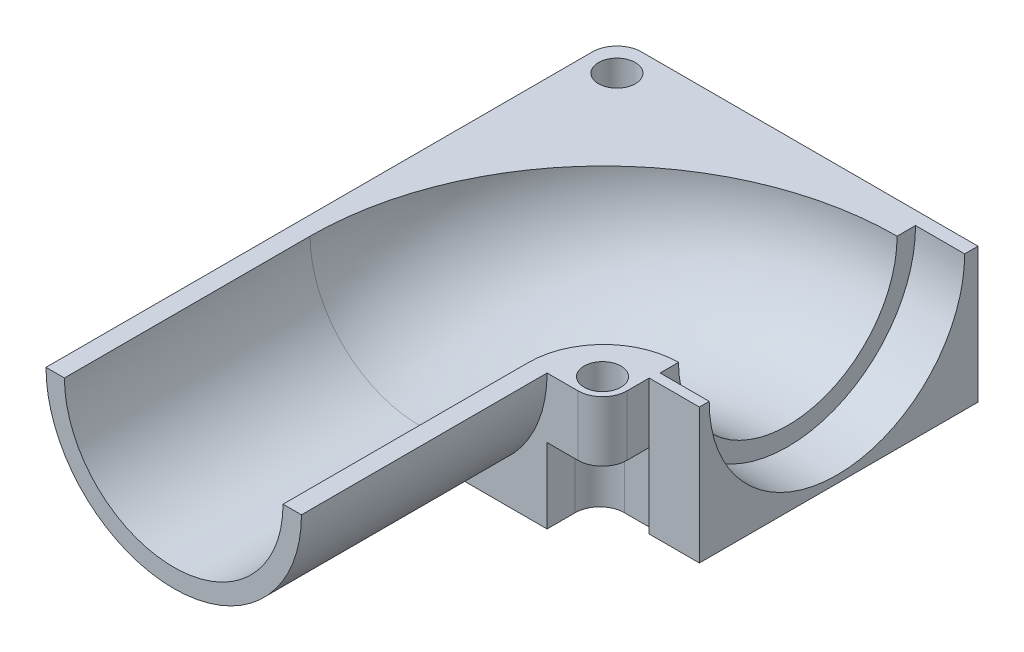
ISO-10303-21;
HEADER;
FILE_DESCRIPTION(('STEP AP214'),'2;1');
FILE_NAME('part.step','',(''),(''),'','','');
FILE_SCHEMA(('AUTOMOTIVE_DESIGN { 1 0 10303 214 1 1 1 1 }'));
ENDSEC;
DATA;
#1=APPLICATION_CONTEXT('core data for automotive mechanical design processes');
#2=APPLICATION_PROTOCOL_DEFINITION('international standard','automotive_design',2000,#1);
#3=PRODUCT_CONTEXT('',#1,'mechanical');
#4=PRODUCT('Part','Part','',(#3));
#5=PRODUCT_RELATED_PRODUCT_CATEGORY('part','',(#4));
#6=PRODUCT_DEFINITION_FORMATION('','',#4);
#7=PRODUCT_DEFINITION_CONTEXT('part definition',#1,'design');
#8=PRODUCT_DEFINITION('design','',#6,#7);
#9=PRODUCT_DEFINITION_SHAPE('','',#8);
#10=(LENGTH_UNIT() NAMED_UNIT(*) SI_UNIT(.MILLI.,.METRE.));
#11=(NAMED_UNIT(*) PLANE_ANGLE_UNIT() SI_UNIT($,.RADIAN.));
#12=(NAMED_UNIT(*) SI_UNIT($,.STERADIAN.) SOLID_ANGLE_UNIT());
#13=UNCERTAINTY_MEASURE_WITH_UNIT(LENGTH_MEASURE(1.E-05),#10,'distance_accuracy_value','');
#14=(GEOMETRIC_REPRESENTATION_CONTEXT(3) GLOBAL_UNCERTAINTY_ASSIGNED_CONTEXT((#13)) GLOBAL_UNIT_ASSIGNED_CONTEXT((#10,
#11,#12)) REPRESENTATION_CONTEXT('',''));
#15=CARTESIAN_POINT('',(0.,0.,0.));
#16=DIRECTION('',(0.,0.,1.));
#17=DIRECTION('',(1.,0.,0.));
#18=AXIS2_PLACEMENT_3D('',#15,#16,#17);
#19=CARTESIAN_POINT('',(-20.,0.,0.));
#20=DIRECTION('',(0.,1.,0.));
#21=DIRECTION('',(0.,0.,1.));
#22=AXIS2_PLACEMENT_3D('',#19,#20,#21);
#23=PLANE('',#22);
#24=DIRECTION('',(0.,0.,1.));
#25=VECTOR('',#24,1.);
#26=CARTESIAN_POINT('',(-43.4,0.,-11.4859338343792));
#27=LINE('',#26,#25);
#28=CARTESIAN_POINT('',(-43.4,0.,-11.4859338343792));
#29=VERTEX_POINT('',#28);
#30=CARTESIAN_POINT('',(-43.4,0.,-7.48593383437924));
#31=VERTEX_POINT('',#30);
#32=EDGE_CURVE('E234',#29,#31,#27,.T.);
#33=ORIENTED_EDGE('',*,*,#32,.F.);
#34=DIRECTION('',(-1.,0.,0.));
#35=VECTOR('',#34,1.);
#36=CARTESIAN_POINT('',(-20.,0.,-11.4859338343792));
#37=LINE('',#36,#35);
#38=CARTESIAN_POINT('',(-20.,0.,-11.4859338343792));
#39=VERTEX_POINT('',#38);
#40=EDGE_CURVE('E337',#39,#29,#37,.T.);
#41=ORIENTED_EDGE('',*,*,#40,.F.);
#42=DIRECTION('',(0.,0.,1.));
#43=VECTOR('',#42,1.);
#44=CARTESIAN_POINT('',(-20.,0.,-14.4859338343792));
#45=LINE('',#44,#43);
#46=CARTESIAN_POINT('',(-20.,0.,11.2));
#47=VERTEX_POINT('',#46);
#48=EDGE_CURVE('E221',#39,#47,#45,.T.);
#49=ORIENTED_EDGE('',*,*,#48,.T.);
#50=DIRECTION('',(1.,0.,0.));
#51=VECTOR('',#50,1.);
#52=CARTESIAN_POINT('',(-20.,0.,11.2));
#53=LINE('',#52,#51);
#54=CARTESIAN_POINT('',(-24.0873861292754,0.,11.2));
#55=VERTEX_POINT('',#54);
#56=EDGE_CURVE('E310',#55,#47,#53,.T.);
#57=ORIENTED_EDGE('',*,*,#56,.F.);
#58=DIRECTION('',(0.,0.,1.));
#59=VECTOR('',#58,1.);
#60=CARTESIAN_POINT('',(-24.0873861292754,0.,10.7081648037772));
#61=LINE('',#60,#59);
#62=CARTESIAN_POINT('',(-24.0873861292754,0.,10.7081648037772));
#63=VERTEX_POINT('',#62);
#64=EDGE_CURVE('E295',#63,#55,#61,.T.);
#65=ORIENTED_EDGE('',*,*,#64,.F.);
#66=DIRECTION('',(1.,0.,0.));
#67=VECTOR('',#66,1.);
#68=CARTESIAN_POINT('',(-24.0873861292754,0.,10.7081648037772));
#69=LINE('',#68,#67);
#70=CARTESIAN_POINT('',(-26.6,0.,10.7081648037772));
#71=VERTEX_POINT('',#70);
#72=EDGE_CURVE('E276',#71,#63,#69,.T.);
#73=ORIENTED_EDGE('',*,*,#72,.F.);
#74=CARTESIAN_POINT('',(-26.6,0.,12.7081648037772));
#75=DIRECTION('',(0.,-1.,0.));
#76=DIRECTION('',(0.,0.,-1.));
#77=AXIS2_PLACEMENT_3D('',#74,#75,#76);
#78=CIRCLE('',#77,2.);
#79=CARTESIAN_POINT('',(-28.6,0.,12.7081648037772));
#80=VERTEX_POINT('',#79);
#81=EDGE_CURVE('E280',#80,#71,#78,.T.);
#82=ORIENTED_EDGE('',*,*,#81,.F.);
#83=DIRECTION('',(0.,0.,-1.));
#84=VECTOR('',#83,1.);
#85=CARTESIAN_POINT('',(-28.6,0.,12.7081648037772));
#86=LINE('',#85,#84);
#87=CARTESIAN_POINT('',(-28.6,0.,15.));
#88=VERTEX_POINT('',#87);
#89=EDGE_CURVE('E298',#88,#80,#86,.T.);
#90=ORIENTED_EDGE('',*,*,#89,.F.);
#91=DIRECTION('',(-1.,0.,0.));
#92=VECTOR('',#91,1.);
#93=CARTESIAN_POINT('',(-20.,0.,15.));
#94=LINE('',#93,#92);
#95=CARTESIAN_POINT('',(-49.4,0.,15.));
#96=VERTEX_POINT('',#95);
#97=EDGE_CURVE('E11',#88,#96,#94,.T.);
#98=ORIENTED_EDGE('',*,*,#97,.T.);
#99=DIRECTION('',(0.,0.,1.));
#100=VECTOR('',#99,1.);
#101=CARTESIAN_POINT('',(-49.4,0.,-9.48593383437924));
#102=LINE('',#101,#100);
#103=CARTESIAN_POINT('',(-49.4,0.,-5.48593383437924));
#104=VERTEX_POINT('',#103);
#105=EDGE_CURVE('E332',#104,#96,#102,.T.);
#106=ORIENTED_EDGE('',*,*,#105,.F.);
#107=DIRECTION('',(-1.,0.,0.));
#108=VECTOR('',#107,1.);
#109=CARTESIAN_POINT('',(-45.4,0.,-5.48593383437924));
#110=LINE('',#109,#108);
#111=CARTESIAN_POINT('',(-45.4,0.,-5.48593383437924));
#112=VERTEX_POINT('',#111);
#113=EDGE_CURVE('E254',#112,#104,#110,.T.);
#114=ORIENTED_EDGE('',*,*,#113,.F.);
#115=CARTESIAN_POINT('',(-45.4,0.,-7.48593383437924));
#116=DIRECTION('',(0.,-1.,0.));
#117=DIRECTION('',(0.,0.,1.));
#118=AXIS2_PLACEMENT_3D('',#115,#116,#117);
#119=CIRCLE('',#118,2.);
#120=EDGE_CURVE('E239',#31,#112,#119,.T.);
#121=ORIENTED_EDGE('',*,*,#120,.F.);
#122=EDGE_LOOP('',(#33,#41,#49,#57,#65,#73,#82,#90,#98,#106,#114,#121));
#123=FACE_BOUND('',#122,.T.);
#124=ADVANCED_FACE('F37',(#123),#23,.F.);
#125=CARTESIAN_POINT('',(-49.4,11.,-9.48593383437924));
#126=DIRECTION('',(-1.,0.,0.));
#127=DIRECTION('',(0.,0.,-1.));
#128=AXIS2_PLACEMENT_3D('',#125,#126,#127);
#129=PLANE('',#128);
#130=ORIENTED_EDGE('',*,*,#105,.T.);
#131=DIRECTION('',(0.,-1.,0.));
#132=VECTOR('',#131,1.);
#133=CARTESIAN_POINT('',(-49.4,11.,15.));
#134=LINE('',#133,#132);
#135=CARTESIAN_POINT('',(-49.4,11.,15.));
#136=VERTEX_POINT('',#135);
#137=EDGE_CURVE('E353',#136,#96,#134,.T.);
#138=ORIENTED_EDGE('',*,*,#137,.F.);
#139=DIRECTION('',(0.,0.,1.));
#140=VECTOR('',#139,1.);
#141=CARTESIAN_POINT('',(-49.4,11.,-9.48593383437924));
#142=LINE('',#141,#140);
#143=CARTESIAN_POINT('',(-49.4,11.,-9.48593383437924));
#144=VERTEX_POINT('',#143);
#145=EDGE_CURVE('E333',#144,#136,#142,.T.);
#146=ORIENTED_EDGE('',*,*,#145,.F.);
#147=DIRECTION('',(0.,-1.,0.));
#148=VECTOR('',#147,1.);
#149=CARTESIAN_POINT('',(-49.4,11.,-9.48593383437924));
#150=LINE('',#149,#148);
#151=CARTESIAN_POINT('',(-49.4,6.1,-9.48593383437924));
#152=VERTEX_POINT('',#151);
#153=EDGE_CURVE('E342',#144,#152,#150,.T.);
#154=ORIENTED_EDGE('',*,*,#153,.T.);
#155=DIRECTION('',(0.,0.,-1.));
#156=VECTOR('',#155,1.);
#157=CARTESIAN_POINT('',(-49.4,6.1,-5.48593383437924));
#158=LINE('',#157,#156);
#159=CARTESIAN_POINT('',(-49.4,6.1,-5.48593383437924));
#160=VERTEX_POINT('',#159);
#161=EDGE_CURVE('E259',#160,#152,#158,.T.);
#162=ORIENTED_EDGE('',*,*,#161,.F.);
#163=DIRECTION('',(0.,-1.,0.));
#164=VECTOR('',#163,1.);
#165=CARTESIAN_POINT('',(-49.4,6.1,-5.48593383437924));
#166=LINE('',#165,#164);
#167=EDGE_CURVE('E270',#160,#104,#166,.T.);
#168=ORIENTED_EDGE('',*,*,#167,.T.);
#169=EDGE_LOOP('',(#130,#138,#146,#154,#162,#168));
#170=FACE_BOUND('',#169,.T.);
#171=ADVANCED_FACE('F446',(#170),#129,.T.);
#172=CARTESIAN_POINT('',(-20.,11.,-11.4859338343792));
#173=DIRECTION('',(0.,0.,-1.));
#174=DIRECTION('',(1.,0.,0.));
#175=AXIS2_PLACEMENT_3D('',#172,#173,#174);
#176=PLANE('',#175);
#177=DIRECTION('',(1.,0.,0.));
#178=VECTOR('',#177,1.);
#179=CARTESIAN_POINT('',(-43.4,6.1,-11.4859338343792));
#180=LINE('',#179,#178);
#181=CARTESIAN_POINT('',(-47.4,6.1,-11.4859338343792));
#182=VERTEX_POINT('',#181);
#183=CARTESIAN_POINT('',(-43.4,6.1,-11.4859338343792));
#184=VERTEX_POINT('',#183);
#185=EDGE_CURVE('E262',#182,#184,#180,.T.);
#186=ORIENTED_EDGE('',*,*,#185,.F.);
#187=DIRECTION('',(0.,-1.,0.));
#188=VECTOR('',#187,1.);
#189=CARTESIAN_POINT('',(-47.4,11.,-11.4859338343792));
#190=LINE('',#189,#188);
#191=CARTESIAN_POINT('',(-47.4,11.,-11.4859338343792));
#192=VERTEX_POINT('',#191);
#193=EDGE_CURVE('E349',#192,#182,#190,.T.);
#194=ORIENTED_EDGE('',*,*,#193,.F.);
#195=DIRECTION('',(-1.,0.,0.));
#196=VECTOR('',#195,1.);
#197=CARTESIAN_POINT('',(-20.,11.,-11.4859338343792));
#198=LINE('',#197,#196);
#199=CARTESIAN_POINT('',(-20.,11.,-11.4859338343792));
#200=VERTEX_POINT('',#199);
#201=EDGE_CURVE('E336',#200,#192,#198,.T.);
#202=ORIENTED_EDGE('',*,*,#201,.F.);
#203=DIRECTION('',(0.,-1.,0.));
#204=VECTOR('',#203,1.);
#205=CARTESIAN_POINT('',(-20.,11.,-11.4859338343792));
#206=LINE('',#205,#204);
#207=EDGE_CURVE('E351',#200,#39,#206,.T.);
#208=ORIENTED_EDGE('',*,*,#207,.T.);
#209=ORIENTED_EDGE('',*,*,#40,.T.);
#210=DIRECTION('',(0.,-1.,0.));
#211=VECTOR('',#210,1.);
#212=CARTESIAN_POINT('',(-43.4,6.1,-11.4859338343792));
#213=LINE('',#212,#211);
#214=EDGE_CURVE('E263',#184,#29,#213,.T.);
#215=ORIENTED_EDGE('',*,*,#214,.F.);
#216=EDGE_LOOP('',(#186,#194,#202,#208,#209,#215));
#217=FACE_BOUND('',#216,.T.);
#218=ADVANCED_FACE('F426',(#217),#176,.T.);
#219=CARTESIAN_POINT('',(-39.,11.,15.));
#220=DIRECTION('',(0.,0.,1.));
#221=DIRECTION('',(-1.,0.,0.));
#222=AXIS2_PLACEMENT_3D('',#219,#220,#221);
#223=PLANE('',#222);
#224=DIRECTION('',(-1.,0.,0.));
#225=VECTOR('',#224,1.);
#226=CARTESIAN_POINT('',(-28.6,6.1,15.));
#227=LINE('',#226,#225);
#228=CARTESIAN_POINT('',(-26.0873861292754,6.1,15.));
#229=VERTEX_POINT('',#228);
#230=CARTESIAN_POINT('',(-28.6,6.1,15.));
#231=VERTEX_POINT('',#230);
#232=EDGE_CURVE('E284',#229,#231,#227,.T.);
#233=ORIENTED_EDGE('',*,*,#232,.F.);
#234=DIRECTION('',(0.,-1.,0.));
#235=VECTOR('',#234,1.);
#236=CARTESIAN_POINT('',(-26.0873861292754,11.,15.));
#237=LINE('',#236,#235);
#238=CARTESIAN_POINT('',(-26.0873861292754,11.,15.));
#239=VERTEX_POINT('',#238);
#240=EDGE_CURVE('E329',#239,#229,#237,.T.);
#241=ORIENTED_EDGE('',*,*,#240,.F.);
#242=DIRECTION('',(1.,0.,0.));
#243=VECTOR('',#242,1.);
#244=CARTESIAN_POINT('',(-17.8909240461541,11.,15.));
#245=LINE('',#244,#243);
#246=CARTESIAN_POINT('',(-28.6,11.,15.));
#247=VERTEX_POINT('',#246);
#248=EDGE_CURVE('E371',#247,#239,#245,.T.);
#249=ORIENTED_EDGE('',*,*,#248,.F.);
#250=CARTESIAN_POINT('',(-39.,11.,15.));
#251=DIRECTION('',(0.,0.,1.));
#252=DIRECTION('',(-1.,0.,0.));
#253=AXIS2_PLACEMENT_3D('',#250,#251,#252);
#254=CIRCLE('',#253,10.4);
#255=EDGE_CURVE('E368',#136,#247,#254,.T.);
#256=ORIENTED_EDGE('',*,*,#255,.F.);
#257=ORIENTED_EDGE('',*,*,#137,.T.);
#258=ORIENTED_EDGE('',*,*,#97,.F.);
#259=DIRECTION('',(0.,-1.,0.));
#260=VECTOR('',#259,1.);
#261=CARTESIAN_POINT('',(-28.6,6.1,15.));
#262=LINE('',#261,#260);
#263=EDGE_CURVE('E306',#231,#88,#262,.T.);
#264=ORIENTED_EDGE('',*,*,#263,.F.);
#265=EDGE_LOOP('',(#233,#241,#249,#256,#257,#258,#264));
#266=FACE_BOUND('',#265,.T.);
#267=ADVANCED_FACE('F398',(#266),#223,.T.);
#268=CARTESIAN_POINT('',(-26.0873861292754,11.,13.));
#269=DIRECTION('',(0.,-1.,0.));
#270=DIRECTION('',(0.,0.,-1.));
#271=AXIS2_PLACEMENT_3D('',#268,#269,#270);
#272=CYLINDRICAL_SURFACE('',#271,2.);
#273=DIRECTION('',(0.,-1.,0.));
#274=VECTOR('',#273,1.);
#275=CARTESIAN_POINT('',(-24.0873861292754,11.,13.));
#276=LINE('',#275,#274);
#277=CARTESIAN_POINT('',(-24.0873861292754,11.,13.));
#278=VERTEX_POINT('',#277);
#279=CARTESIAN_POINT('',(-24.0873861292754,6.1,13.));
#280=VERTEX_POINT('',#279);
#281=EDGE_CURVE('E326',#278,#280,#276,.T.);
#282=ORIENTED_EDGE('',*,*,#281,.F.);
#283=CARTESIAN_POINT('',(-26.0873861292754,11.,13.));
#284=DIRECTION('',(0.,1.,0.));
#285=DIRECTION('',(0.,0.,-1.));
#286=AXIS2_PLACEMENT_3D('',#283,#284,#285);
#287=CIRCLE('',#286,2.);
#288=EDGE_CURVE('E311',#239,#278,#287,.T.);
#289=ORIENTED_EDGE('',*,*,#288,.F.);
#290=ORIENTED_EDGE('',*,*,#240,.T.);
#291=CARTESIAN_POINT('',(-26.0873861292754,6.1,13.));
#292=DIRECTION('',(0.,-1.,0.));
#293=DIRECTION('',(0.,0.,1.));
#294=AXIS2_PLACEMENT_3D('',#291,#292,#293);
#295=CIRCLE('',#294,2.);
#296=EDGE_CURVE('E282',#280,#229,#295,.T.);
#297=ORIENTED_EDGE('',*,*,#296,.F.);
#298=EDGE_LOOP('',(#282,#289,#290,#297));
#299=FACE_BOUND('',#298,.T.);
#300=ADVANCED_FACE('F402',(#299),#272,.T.);
#301=CARTESIAN_POINT('',(-24.0873861292754,11.,11.2));
#302=DIRECTION('',(1.,0.,0.));
#303=DIRECTION('',(0.,0.,1.));
#304=AXIS2_PLACEMENT_3D('',#301,#302,#303);
#305=PLANE('',#304);
#306=DIRECTION('',(0.,-1.,0.));
#307=VECTOR('',#306,1.);
#308=CARTESIAN_POINT('',(-24.0873861292754,11.,11.2));
#309=LINE('',#308,#307);
#310=CARTESIAN_POINT('',(-24.0873861292754,11.,11.2));
#311=VERTEX_POINT('',#310);
#312=CARTESIAN_POINT('',(-24.0873861292754,6.1,11.2));
#313=VERTEX_POINT('',#312);
#314=EDGE_CURVE('E323',#311,#313,#309,.T.);
#315=ORIENTED_EDGE('',*,*,#314,.F.);
#316=DIRECTION('',(0.,0.,-1.));
#317=VECTOR('',#316,1.);
#318=CARTESIAN_POINT('',(-24.0873861292754,11.,11.2));
#319=LINE('',#318,#317);
#320=EDGE_CURVE('E314',#278,#311,#319,.T.);
#321=ORIENTED_EDGE('',*,*,#320,.F.);
#322=ORIENTED_EDGE('',*,*,#281,.T.);
#323=DIRECTION('',(0.,0.,1.));
#324=VECTOR('',#323,1.);
#325=CARTESIAN_POINT('',(-24.0873861292754,6.1,10.7081648037772));
#326=LINE('',#325,#324);
#327=EDGE_CURVE('E279',#313,#280,#326,.T.);
#328=ORIENTED_EDGE('',*,*,#327,.F.);
#329=EDGE_LOOP('',(#315,#321,#322,#328));
#330=FACE_BOUND('',#329,.T.);
#331=ADVANCED_FACE('F406',(#330),#305,.T.);
#332=CARTESIAN_POINT('',(-20.,11.,-14.4859338343792));
#333=DIRECTION('',(-1.,0.,0.));
#334=DIRECTION('',(0.,0.,-1.));
#335=AXIS2_PLACEMENT_3D('',#332,#333,#334);
#336=PLANE('',#335);
#337=DIRECTION('',(0.,-1.,0.));
#338=VECTOR('',#337,1.);
#339=CARTESIAN_POINT('',(-20.,11.,11.2));
#340=LINE('',#339,#338);
#341=CARTESIAN_POINT('',(-20.,11.,11.2));
#342=VERTEX_POINT('',#341);
#343=EDGE_CURVE('E318',#342,#47,#340,.T.);
#344=ORIENTED_EDGE('',*,*,#343,.T.);
#345=ORIENTED_EDGE('',*,*,#48,.F.);
#346=ORIENTED_EDGE('',*,*,#207,.F.);
#347=DIRECTION('',(0.,0.,1.));
#348=VECTOR('',#347,1.);
#349=CARTESIAN_POINT('',(-20.,11.,-14.4859338343792));
#350=LINE('',#349,#348);
#351=CARTESIAN_POINT('',(-20.,11.,-10.4));
#352=VERTEX_POINT('',#351);
#353=EDGE_CURVE('E46',#200,#352,#350,.T.);
#354=ORIENTED_EDGE('',*,*,#353,.T.);
#355=CARTESIAN_POINT('',(-20.,11.,0.));
#356=DIRECTION('',(1.,0.,0.));
#357=DIRECTION('',(0.,0.,1.));
#358=AXIS2_PLACEMENT_3D('',#355,#356,#357);
#359=CIRCLE('',#358,10.4);
#360=CARTESIAN_POINT('',(-20.,11.,10.4));
#361=VERTEX_POINT('',#360);
#362=EDGE_CURVE('E355',#361,#352,#359,.T.);
#363=ORIENTED_EDGE('',*,*,#362,.F.);
#364=EDGE_CURVE('E230',#361,#342,#350,.T.);
#365=ORIENTED_EDGE('',*,*,#364,.T.);
#366=EDGE_LOOP('',(#344,#345,#346,#354,#363,#365));
#367=FACE_BOUND('',#366,.T.);
#368=ADVANCED_FACE('F39',(#367),#336,.F.);
#369=CARTESIAN_POINT('',(-20.,11.,0.));
#370=DIRECTION('',(0.,1.,0.));
#371=DIRECTION('',(0.,0.,1.));
#372=AXIS2_PLACEMENT_3D('',#369,#370,#371);
#373=PLANE('',#372);
#374=CARTESIAN_POINT('',(-26.0873861292754,11.,13.));
#375=DIRECTION('',(0.,-1.,0.));
#376=DIRECTION('',(0.,0.,1.));
#377=AXIS2_PLACEMENT_3D('',#374,#375,#376);
#378=CIRCLE('',#377,1.5);
#379=CARTESIAN_POINT('',(-26.0873861292754,11.,14.5));
#380=VERTEX_POINT('',#379);
#381=EDGE_CURVE('E235',#380,#380,#378,.T.);
#382=ORIENTED_EDGE('',*,*,#381,.T.);
#383=EDGE_LOOP('',(#382));
#384=FACE_BOUND('',#383,.T.);
#385=ORIENTED_EDGE('',*,*,#320,.T.);
#386=DIRECTION('',(1.,0.,0.));
#387=VECTOR('',#386,1.);
#388=CARTESIAN_POINT('',(-20.,11.,11.2));
#389=LINE('',#388,#387);
#390=EDGE_CURVE('E316',#311,#342,#389,.T.);
#391=ORIENTED_EDGE('',*,*,#390,.T.);
#392=ORIENTED_EDGE('',*,*,#364,.F.);
#393=DIRECTION('',(1.,0.,0.));
#394=VECTOR('',#393,1.);
#395=CARTESIAN_POINT('',(-24.,11.,10.4));
#396=LINE('',#395,#394);
#397=CARTESIAN_POINT('',(-24.,11.,10.4));
#398=VERTEX_POINT('',#397);
#399=EDGE_CURVE('E362',#398,#361,#396,.T.);
#400=ORIENTED_EDGE('',*,*,#399,.F.);
#401=DIRECTION('',(0.,0.,1.));
#402=VECTOR('',#401,1.);
#403=CARTESIAN_POINT('',(-24.,11.,-10.4));
#404=LINE('',#403,#402);
#405=CARTESIAN_POINT('',(-24.,11.,8.9));
#406=VERTEX_POINT('',#405);
#407=EDGE_CURVE('E358',#406,#398,#404,.T.);
#408=ORIENTED_EDGE('',*,*,#407,.F.);
#409=CARTESIAN_POINT('',(-24.,11.,15.));
#410=DIRECTION('',(0.,1.,0.));
#411=DIRECTION('',(0.,0.,-1.));
#412=AXIS2_PLACEMENT_3D('',#409,#410,#411);
#413=CIRCLE('',#412,6.1);
#414=CARTESIAN_POINT('',(-30.1,11.,15.));
#415=VERTEX_POINT('',#414);
#416=EDGE_CURVE('E218',#406,#415,#413,.T.);
#417=ORIENTED_EDGE('',*,*,#416,.T.);
#418=DIRECTION('',(0.,0.,1.));
#419=VECTOR('',#418,1.);
#420=CARTESIAN_POINT('',(-30.1,11.,15.));
#421=LINE('',#420,#419);
#422=CARTESIAN_POINT('',(-30.1,11.,35.));
#423=VERTEX_POINT('',#422);
#424=EDGE_CURVE('E199',#415,#423,#421,.T.);
#425=ORIENTED_EDGE('',*,*,#424,.T.);
#426=DIRECTION('',(1.,0.,0.));
#427=VECTOR('',#426,1.);
#428=CARTESIAN_POINT('',(-30.1,11.,35.));
#429=LINE('',#428,#427);
#430=CARTESIAN_POINT('',(-28.6,11.,35.));
#431=VERTEX_POINT('',#430);
#432=EDGE_CURVE('E206',#423,#431,#429,.T.);
#433=ORIENTED_EDGE('',*,*,#432,.T.);
#434=DIRECTION('',(0.,0.,1.));
#435=VECTOR('',#434,1.);
#436=CARTESIAN_POINT('',(-28.6,11.,15.));
#437=LINE('',#436,#435);
#438=EDGE_CURVE('E375',#247,#431,#437,.T.);
#439=ORIENTED_EDGE('',*,*,#438,.F.);
#440=ORIENTED_EDGE('',*,*,#248,.T.);
#441=ORIENTED_EDGE('',*,*,#288,.T.);
#442=EDGE_LOOP('',(#385,#391,#392,#400,#408,#417,#425,#433,#439,#440,#441));
#443=FACE_BOUND('',#442,.T.);
#444=ADVANCED_FACE('F215',(#384,#443),#373,.T.);
#445=CARTESIAN_POINT('',(-46.9,11.,-8.98593383437924));
#446=DIRECTION('',(0.,-1.,0.));
#447=DIRECTION('',(0.,0.,1.));
#448=AXIS2_PLACEMENT_3D('',#445,#446,#447);
#449=CIRCLE('',#448,1.5);
#450=CARTESIAN_POINT('',(-46.9,11.,-7.48593383437924));
#451=VERTEX_POINT('',#450);
#452=EDGE_CURVE('E246',#451,#451,#449,.T.);
#453=ORIENTED_EDGE('',*,*,#452,.T.);
#454=EDGE_LOOP('',(#453));
#455=FACE_BOUND('',#454,.T.);
#456=DIRECTION('',(0.,0.,1.));
#457=VECTOR('',#456,1.);
#458=CARTESIAN_POINT('',(-49.4,11.,15.));
#459=LINE('',#458,#457);
#460=CARTESIAN_POINT('',(-49.4,11.,35.));
#461=VERTEX_POINT('',#460);
#462=EDGE_CURVE('E374',#136,#461,#459,.T.);
#463=ORIENTED_EDGE('',*,*,#462,.T.);
#464=DIRECTION('',(1.,0.,0.));
#465=VECTOR('',#464,1.);
#466=CARTESIAN_POINT('',(-47.9,11.,35.));
#467=LINE('',#466,#465);
#468=CARTESIAN_POINT('',(-47.9,11.,35.));
#469=VERTEX_POINT('',#468);
#470=EDGE_CURVE('E387',#461,#469,#467,.T.);
#471=ORIENTED_EDGE('',*,*,#470,.T.);
#472=DIRECTION('',(0.,0.,1.));
#473=VECTOR('',#472,1.);
#474=CARTESIAN_POINT('',(-47.9,11.,15.));
#475=LINE('',#474,#473);
#476=CARTESIAN_POINT('',(-47.9,11.,15.));
#477=VERTEX_POINT('',#476);
#478=EDGE_CURVE('E202',#477,#469,#475,.T.);
#479=ORIENTED_EDGE('',*,*,#478,.F.);
#480=CARTESIAN_POINT('',(-24.,11.,15.));
#481=DIRECTION('',(0.,1.,0.));
#482=DIRECTION('',(0.,0.,-1.));
#483=AXIS2_PLACEMENT_3D('',#480,#481,#482);
#484=CIRCLE('',#483,23.9);
#485=CARTESIAN_POINT('',(-24.,11.,-8.90000000000001));
#486=VERTEX_POINT('',#485);
#487=EDGE_CURVE('E219',#486,#477,#484,.T.);
#488=ORIENTED_EDGE('',*,*,#487,.F.);
#489=CARTESIAN_POINT('',(-24.,11.,-10.4));
#490=VERTEX_POINT('',#489);
#491=EDGE_CURVE('E359',#490,#486,#404,.T.);
#492=ORIENTED_EDGE('',*,*,#491,.F.);
#493=DIRECTION('',(1.,0.,0.));
#494=VECTOR('',#493,1.);
#495=CARTESIAN_POINT('',(-24.,11.,-10.4));
#496=LINE('',#495,#494);
#497=EDGE_CURVE('E366',#490,#352,#496,.T.);
#498=ORIENTED_EDGE('',*,*,#497,.T.);
#499=ORIENTED_EDGE('',*,*,#353,.F.);
#500=ORIENTED_EDGE('',*,*,#201,.T.);
#501=CARTESIAN_POINT('',(-47.4,11.,-9.48593383437924));
#502=DIRECTION('',(0.,1.,0.));
#503=DIRECTION('',(0.,0.,-1.));
#504=AXIS2_PLACEMENT_3D('',#501,#502,#503);
#505=CIRCLE('',#504,2.);
#506=EDGE_CURVE('E340',#192,#144,#505,.T.);
#507=ORIENTED_EDGE('',*,*,#506,.T.);
#508=ORIENTED_EDGE('',*,*,#145,.T.);
#509=EDGE_LOOP('',(#463,#471,#479,#488,#492,#498,#499,#500,#507,#508));
#510=FACE_BOUND('',#509,.T.);
#511=ADVANCED_FACE('F386',(#455,#510),#373,.T.);
#512=CARTESIAN_POINT('',(-24.,11.,15.));
#513=DIRECTION('',(0.,-1.,0.));
#514=DIRECTION('',(0.,0.,-1.));
#515=AXIS2_PLACEMENT_3D('',#512,#513,#514);
#516=TOROIDAL_SURFACE('',#515,15.,8.9);
#517=ORIENTED_EDGE('',*,*,#487,.T.);
#518=CARTESIAN_POINT('',(-39.,11.,15.));
#519=DIRECTION('',(0.,0.,-1.));
#520=DIRECTION('',(-1.,0.,0.));
#521=AXIS2_PLACEMENT_3D('',#518,#519,#520);
#522=CIRCLE('',#521,8.9);
#523=EDGE_CURVE('E224',#415,#477,#522,.T.);
#524=ORIENTED_EDGE('',*,*,#523,.F.);
#525=ORIENTED_EDGE('',*,*,#416,.F.);
#526=CARTESIAN_POINT('',(-24.,11.,0.));
#527=DIRECTION('',(1.,0.,0.));
#528=DIRECTION('',(0.,0.,-1.));
#529=AXIS2_PLACEMENT_3D('',#526,#527,#528);
#530=CIRCLE('',#529,8.9);
#531=EDGE_CURVE('E377',#406,#486,#530,.T.);
#532=ORIENTED_EDGE('',*,*,#531,.T.);
#533=EDGE_LOOP('',(#517,#524,#525,#532));
#534=FACE_BOUND('',#533,.T.);
#535=ADVANCED_FACE('F383',(#534),#516,.F.);
#536=CARTESIAN_POINT('',(-39.,11.,15.));
#537=DIRECTION('',(0.,0.,1.));
#538=DIRECTION('',(-1.,0.,0.));
#539=AXIS2_PLACEMENT_3D('',#536,#537,#538);
#540=CYLINDRICAL_SURFACE('',#539,8.9);
#541=ORIENTED_EDGE('',*,*,#424,.F.);
#542=ORIENTED_EDGE('',*,*,#523,.T.);
#543=ORIENTED_EDGE('',*,*,#478,.T.);
#544=CARTESIAN_POINT('',(-39.,11.,35.));
#545=DIRECTION('',(0.,0.,1.));
#546=DIRECTION('',(-1.,0.,0.));
#547=AXIS2_PLACEMENT_3D('',#544,#545,#546);
#548=CIRCLE('',#547,8.9);
#549=EDGE_CURVE('E195',#469,#423,#548,.T.);
#550=ORIENTED_EDGE('',*,*,#549,.T.);
#551=EDGE_LOOP('',(#541,#542,#543,#550));
#552=FACE_BOUND('',#551,.T.);
#553=ADVANCED_FACE('F197',(#552),#540,.F.);
#554=CARTESIAN_POINT('',(-39.,11.,15.));
#555=DIRECTION('',(0.,0.,1.));
#556=DIRECTION('',(-1.,0.,0.));
#557=AXIS2_PLACEMENT_3D('',#554,#555,#556);
#558=CYLINDRICAL_SURFACE('',#557,10.4);
#559=ORIENTED_EDGE('',*,*,#462,.F.);
#560=ORIENTED_EDGE('',*,*,#255,.T.);
#561=ORIENTED_EDGE('',*,*,#438,.T.);
#562=CARTESIAN_POINT('',(-39.,11.,35.));
#563=DIRECTION('',(0.,0.,-1.));
#564=DIRECTION('',(-1.,0.,0.));
#565=AXIS2_PLACEMENT_3D('',#562,#563,#564);
#566=CIRCLE('',#565,10.4);
#567=EDGE_CURVE('E210',#431,#461,#566,.T.);
#568=ORIENTED_EDGE('',*,*,#567,.T.);
#569=EDGE_LOOP('',(#559,#560,#561,#568));
#570=FACE_BOUND('',#569,.T.);
#571=ADVANCED_FACE('F391',(#570),#558,.T.);
#572=CARTESIAN_POINT('',(-24.,11.,0.));
#573=DIRECTION('',(1.,0.,0.));
#574=DIRECTION('',(0.,0.,1.));
#575=AXIS2_PLACEMENT_3D('',#572,#573,#574);
#576=PLANE('',#575);
#577=ORIENTED_EDGE('',*,*,#531,.F.);
#578=ORIENTED_EDGE('',*,*,#407,.T.);
#579=CARTESIAN_POINT('',(-24.,11.,0.));
#580=DIRECTION('',(1.,0.,0.));
#581=DIRECTION('',(0.,0.,1.));
#582=AXIS2_PLACEMENT_3D('',#579,#580,#581);
#583=CIRCLE('',#582,10.4);
#584=EDGE_CURVE('E356',#398,#490,#583,.T.);
#585=ORIENTED_EDGE('',*,*,#584,.T.);
#586=ORIENTED_EDGE('',*,*,#491,.T.);
#587=EDGE_LOOP('',(#577,#578,#585,#586));
#588=FACE_BOUND('',#587,.T.);
#589=ADVANCED_FACE('F433',(#588),#576,.T.);
#590=CARTESIAN_POINT('',(-24.,11.,0.));
#591=DIRECTION('',(1.,0.,0.));
#592=DIRECTION('',(0.,0.,1.));
#593=AXIS2_PLACEMENT_3D('',#590,#591,#592);
#594=CYLINDRICAL_SURFACE('',#593,10.4);
#595=ORIENTED_EDGE('',*,*,#362,.T.);
#596=ORIENTED_EDGE('',*,*,#497,.F.);
#597=ORIENTED_EDGE('',*,*,#584,.F.);
#598=ORIENTED_EDGE('',*,*,#399,.T.);
#599=EDGE_LOOP('',(#595,#596,#597,#598));
#600=FACE_BOUND('',#599,.T.);
#601=ADVANCED_FACE('F430',(#600),#594,.F.);
#602=CARTESIAN_POINT('',(-47.4,11.,-9.48593383437924));
#603=DIRECTION('',(0.,-1.,0.));
#604=DIRECTION('',(0.,0.,-1.));
#605=AXIS2_PLACEMENT_3D('',#602,#603,#604);
#606=CYLINDRICAL_SURFACE('',#605,2.);
#607=CARTESIAN_POINT('',(-47.4,6.1,-9.48593383437924));
#608=DIRECTION('',(0.,-1.,0.));
#609=DIRECTION('',(0.,0.,1.));
#610=AXIS2_PLACEMENT_3D('',#607,#608,#609);
#611=CIRCLE('',#610,2.);
#612=EDGE_CURVE('E54',#152,#182,#611,.T.);
#613=ORIENTED_EDGE('',*,*,#612,.F.);
#614=ORIENTED_EDGE('',*,*,#153,.F.);
#615=ORIENTED_EDGE('',*,*,#506,.F.);
#616=ORIENTED_EDGE('',*,*,#193,.T.);
#617=EDGE_LOOP('',(#613,#614,#615,#616));
#618=FACE_BOUND('',#617,.T.);
#619=ADVANCED_FACE('F440',(#618),#606,.T.);
#620=CARTESIAN_POINT('',(-20.,11.,11.2));
#621=DIRECTION('',(0.,0.,1.));
#622=DIRECTION('',(-1.,0.,0.));
#623=AXIS2_PLACEMENT_3D('',#620,#621,#622);
#624=PLANE('',#623);
#625=ORIENTED_EDGE('',*,*,#56,.T.);
#626=ORIENTED_EDGE('',*,*,#343,.F.);
#627=ORIENTED_EDGE('',*,*,#390,.F.);
#628=ORIENTED_EDGE('',*,*,#314,.T.);
#629=EDGE_CURVE('E322',#313,#55,#309,.T.);
#630=ORIENTED_EDGE('',*,*,#629,.T.);
#631=EDGE_LOOP('',(#625,#626,#627,#628,#630));
#632=FACE_BOUND('',#631,.T.);
#633=ADVANCED_FACE('F415',(#632),#624,.T.);
#634=CARTESIAN_POINT('',(-24.0873861292754,6.1,10.7081648037772));
#635=DIRECTION('',(0.,0.,1.));
#636=DIRECTION('',(-1.,0.,0.));
#637=AXIS2_PLACEMENT_3D('',#634,#635,#636);
#638=PLANE('',#637);
#639=ORIENTED_EDGE('',*,*,#72,.T.);
#640=DIRECTION('',(0.,-1.,0.));
#641=VECTOR('',#640,1.);
#642=CARTESIAN_POINT('',(-24.0873861292754,6.1,10.7081648037772));
#643=LINE('',#642,#641);
#644=CARTESIAN_POINT('',(-24.0873861292754,6.1,10.7081648037772));
#645=VERTEX_POINT('',#644);
#646=EDGE_CURVE('E308',#645,#63,#643,.T.);
#647=ORIENTED_EDGE('',*,*,#646,.F.);
#648=DIRECTION('',(1.,0.,0.));
#649=VECTOR('',#648,1.);
#650=CARTESIAN_POINT('',(-24.0873861292754,6.1,10.7081648037772));
#651=LINE('',#650,#649);
#652=CARTESIAN_POINT('',(-26.6,6.1,10.7081648037772));
#653=VERTEX_POINT('',#652);
#654=EDGE_CURVE('E277',#653,#645,#651,.T.);
#655=ORIENTED_EDGE('',*,*,#654,.F.);
#656=DIRECTION('',(0.,-1.,0.));
#657=VECTOR('',#656,1.);
#658=CARTESIAN_POINT('',(-26.6,6.1,10.7081648037772));
#659=LINE('',#658,#657);
#660=EDGE_CURVE('E292',#653,#71,#659,.T.);
#661=ORIENTED_EDGE('',*,*,#660,.T.);
#662=EDGE_LOOP('',(#639,#647,#655,#661));
#663=FACE_BOUND('',#662,.T.);
#664=ADVANCED_FACE('F475',(#663),#638,.T.);
#665=CARTESIAN_POINT('',(-24.0873861292754,6.1,10.7081648037772));
#666=DIRECTION('',(-1.,0.,0.));
#667=DIRECTION('',(0.,0.,-1.));
#668=AXIS2_PLACEMENT_3D('',#665,#666,#667);
#669=PLANE('',#668);
#670=ORIENTED_EDGE('',*,*,#64,.T.);
#671=ORIENTED_EDGE('',*,*,#629,.F.);
#672=EDGE_CURVE('E62',#645,#313,#326,.T.);
#673=ORIENTED_EDGE('',*,*,#672,.F.);
#674=ORIENTED_EDGE('',*,*,#646,.T.);
#675=EDGE_LOOP('',(#670,#671,#673,#674));
#676=FACE_BOUND('',#675,.T.);
#677=ADVANCED_FACE('F478',(#676),#669,.T.);
#678=CARTESIAN_POINT('',(-28.6,6.1,12.7081648037772));
#679=DIRECTION('',(1.,0.,0.));
#680=DIRECTION('',(0.,0.,1.));
#681=AXIS2_PLACEMENT_3D('',#678,#679,#680);
#682=PLANE('',#681);
#683=ORIENTED_EDGE('',*,*,#89,.T.);
#684=DIRECTION('',(0.,-1.,0.));
#685=VECTOR('',#684,1.);
#686=CARTESIAN_POINT('',(-28.6,6.1,12.7081648037772));
#687=LINE('',#686,#685);
#688=CARTESIAN_POINT('',(-28.6,6.1,12.7081648037772));
#689=VERTEX_POINT('',#688);
#690=EDGE_CURVE('E304',#689,#80,#687,.T.);
#691=ORIENTED_EDGE('',*,*,#690,.F.);
#692=DIRECTION('',(0.,0.,-1.));
#693=VECTOR('',#692,1.);
#694=CARTESIAN_POINT('',(-28.6,6.1,12.7081648037772));
#695=LINE('',#694,#693);
#696=EDGE_CURVE('E287',#231,#689,#695,.T.);
#697=ORIENTED_EDGE('',*,*,#696,.F.);
#698=ORIENTED_EDGE('',*,*,#263,.T.);
#699=EDGE_LOOP('',(#683,#691,#697,#698));
#700=FACE_BOUND('',#699,.T.);
#701=ADVANCED_FACE('F482',(#700),#682,.T.);
#702=CARTESIAN_POINT('',(-26.6,6.1,12.7081648037772));
#703=DIRECTION('',(0.,-1.,0.));
#704=DIRECTION('',(0.,0.,-1.));
#705=AXIS2_PLACEMENT_3D('',#702,#703,#704);
#706=CYLINDRICAL_SURFACE('',#705,2.);
#707=ORIENTED_EDGE('',*,*,#81,.T.);
#708=ORIENTED_EDGE('',*,*,#660,.F.);
#709=CARTESIAN_POINT('',(-26.6,6.1,12.7081648037772));
#710=DIRECTION('',(0.,-1.,0.));
#711=DIRECTION('',(0.,0.,-1.));
#712=AXIS2_PLACEMENT_3D('',#709,#710,#711);
#713=CIRCLE('',#712,2.);
#714=EDGE_CURVE('E290',#689,#653,#713,.T.);
#715=ORIENTED_EDGE('',*,*,#714,.F.);
#716=ORIENTED_EDGE('',*,*,#690,.T.);
#717=EDGE_LOOP('',(#707,#708,#715,#716));
#718=FACE_BOUND('',#717,.T.);
#719=ADVANCED_FACE('F486',(#718),#706,.F.);
#720=CARTESIAN_POINT('',(-26.6,6.1,12.7081648037772));
#721=DIRECTION('',(0.,-1.,0.));
#722=DIRECTION('',(0.,0.,-1.));
#723=AXIS2_PLACEMENT_3D('',#720,#721,#722);
#724=PLANE('',#723);
#725=CARTESIAN_POINT('',(-26.0873861292754,6.1,13.));
#726=DIRECTION('',(0.,1.,0.));
#727=DIRECTION('',(0.,0.,-1.));
#728=AXIS2_PLACEMENT_3D('',#725,#726,#727);
#729=CIRCLE('',#728,1.5);
#730=CARTESIAN_POINT('',(-26.0873861292754,6.1,11.5));
#731=VERTEX_POINT('',#730);
#732=EDGE_CURVE('E232',#731,#731,#729,.F.);
#733=ORIENTED_EDGE('',*,*,#732,.F.);
#734=EDGE_LOOP('',(#733));
#735=FACE_BOUND('',#734,.T.);
#736=ORIENTED_EDGE('',*,*,#654,.T.);
#737=ORIENTED_EDGE('',*,*,#672,.T.);
#738=ORIENTED_EDGE('',*,*,#327,.T.);
#739=ORIENTED_EDGE('',*,*,#296,.T.);
#740=ORIENTED_EDGE('',*,*,#232,.T.);
#741=ORIENTED_EDGE('',*,*,#696,.T.);
#742=ORIENTED_EDGE('',*,*,#714,.T.);
#743=EDGE_LOOP('',(#736,#737,#738,#739,#740,#741,#742));
#744=FACE_BOUND('',#743,.T.);
#745=ADVANCED_FACE('F490',(#735,#744),#724,.T.);
#746=CARTESIAN_POINT('',(-43.4,6.1,-11.4859338343792));
#747=DIRECTION('',(-1.,0.,0.));
#748=DIRECTION('',(0.,0.,-1.));
#749=AXIS2_PLACEMENT_3D('',#746,#747,#748);
#750=PLANE('',#749);
#751=ORIENTED_EDGE('',*,*,#32,.T.);
#752=DIRECTION('',(0.,-1.,0.));
#753=VECTOR('',#752,1.);
#754=CARTESIAN_POINT('',(-43.4,6.1,-7.48593383437924));
#755=LINE('',#754,#753);
#756=CARTESIAN_POINT('',(-43.4,6.1,-7.48593383437924));
#757=VERTEX_POINT('',#756);
#758=EDGE_CURVE('E274',#757,#31,#755,.T.);
#759=ORIENTED_EDGE('',*,*,#758,.F.);
#760=DIRECTION('',(0.,0.,1.));
#761=VECTOR('',#760,1.);
#762=CARTESIAN_POINT('',(-43.4,6.1,-11.4859338343792));
#763=LINE('',#762,#761);
#764=EDGE_CURVE('E250',#184,#757,#763,.T.);
#765=ORIENTED_EDGE('',*,*,#764,.F.);
#766=ORIENTED_EDGE('',*,*,#214,.T.);
#767=EDGE_LOOP('',(#751,#759,#765,#766));
#768=FACE_BOUND('',#767,.T.);
#769=ADVANCED_FACE('F494',(#768),#750,.T.);
#770=CARTESIAN_POINT('',(-45.4,6.1,-7.48593383437924));
#771=DIRECTION('',(0.,-1.,0.));
#772=DIRECTION('',(0.,0.,-1.));
#773=AXIS2_PLACEMENT_3D('',#770,#771,#772);
#774=CYLINDRICAL_SURFACE('',#773,2.);
#775=ORIENTED_EDGE('',*,*,#120,.T.);
#776=DIRECTION('',(0.,-1.,0.));
#777=VECTOR('',#776,1.);
#778=CARTESIAN_POINT('',(-45.4,6.1,-5.48593383437924));
#779=LINE('',#778,#777);
#780=CARTESIAN_POINT('',(-45.4,6.1,-5.48593383437924));
#781=VERTEX_POINT('',#780);
#782=EDGE_CURVE('E272',#781,#112,#779,.T.);
#783=ORIENTED_EDGE('',*,*,#782,.F.);
#784=CARTESIAN_POINT('',(-45.4,6.1,-7.48593383437924));
#785=DIRECTION('',(0.,-1.,0.));
#786=DIRECTION('',(0.,0.,1.));
#787=AXIS2_PLACEMENT_3D('',#784,#785,#786);
#788=CIRCLE('',#787,2.);
#789=EDGE_CURVE('E253',#757,#781,#788,.T.);
#790=ORIENTED_EDGE('',*,*,#789,.F.);
#791=ORIENTED_EDGE('',*,*,#758,.T.);
#792=EDGE_LOOP('',(#775,#783,#790,#791));
#793=FACE_BOUND('',#792,.T.);
#794=ADVANCED_FACE('F498',(#793),#774,.F.);
#795=CARTESIAN_POINT('',(-45.4,6.1,-5.48593383437924));
#796=DIRECTION('',(0.,0.,-1.));
#797=DIRECTION('',(1.,0.,0.));
#798=AXIS2_PLACEMENT_3D('',#795,#796,#797);
#799=PLANE('',#798);
#800=ORIENTED_EDGE('',*,*,#113,.T.);
#801=ORIENTED_EDGE('',*,*,#167,.F.);
#802=DIRECTION('',(-1.,0.,0.));
#803=VECTOR('',#802,1.);
#804=CARTESIAN_POINT('',(-45.4,6.1,-5.48593383437924));
#805=LINE('',#804,#803);
#806=EDGE_CURVE('E257',#781,#160,#805,.T.);
#807=ORIENTED_EDGE('',*,*,#806,.F.);
#808=ORIENTED_EDGE('',*,*,#782,.T.);
#809=EDGE_LOOP('',(#800,#801,#807,#808));
#810=FACE_BOUND('',#809,.T.);
#811=ADVANCED_FACE('F502',(#810),#799,.T.);
#812=CARTESIAN_POINT('',(-45.4,6.1,-7.48593383437924));
#813=DIRECTION('',(0.,1.,0.));
#814=DIRECTION('',(0.,0.,1.));
#815=AXIS2_PLACEMENT_3D('',#812,#813,#814);
#816=PLANE('',#815);
#817=CARTESIAN_POINT('',(-46.9,6.1,-8.98593383437924));
#818=DIRECTION('',(0.,-1.,0.));
#819=DIRECTION('',(0.,0.,1.));
#820=AXIS2_PLACEMENT_3D('',#817,#818,#819);
#821=CIRCLE('',#820,1.5);
#822=CARTESIAN_POINT('',(-46.9,6.1,-7.48593383437924));
#823=VERTEX_POINT('',#822);
#824=EDGE_CURVE('E41',#823,#823,#821,.F.);
#825=ORIENTED_EDGE('',*,*,#824,.T.);
#826=EDGE_LOOP('',(#825));
#827=FACE_BOUND('',#826,.T.);
#828=ORIENTED_EDGE('',*,*,#764,.T.);
#829=ORIENTED_EDGE('',*,*,#789,.T.);
#830=ORIENTED_EDGE('',*,*,#806,.T.);
#831=ORIENTED_EDGE('',*,*,#161,.T.);
#832=ORIENTED_EDGE('',*,*,#612,.T.);
#833=ORIENTED_EDGE('',*,*,#185,.T.);
#834=EDGE_LOOP('',(#828,#829,#830,#831,#832,#833));
#835=FACE_BOUND('',#834,.T.);
#836=ADVANCED_FACE('F506',(#827,#835),#816,.F.);
#837=CARTESIAN_POINT('',(-26.0873861292754,11.,13.));
#838=DIRECTION('',(0.,-1.,0.));
#839=DIRECTION('',(0.,0.,-1.));
#840=AXIS2_PLACEMENT_3D('',#837,#838,#839);
#841=CYLINDRICAL_SURFACE('',#840,1.5);
#842=ORIENTED_EDGE('',*,*,#732,.T.);
#843=EDGE_LOOP('',(#842));
#844=FACE_BOUND('',#843,.T.);
#845=ORIENTED_EDGE('',*,*,#381,.F.);
#846=EDGE_LOOP('',(#845));
#847=FACE_BOUND('',#846,.T.);
#848=ADVANCED_FACE('F510',(#844,#847),#841,.F.);
#849=CARTESIAN_POINT('',(-46.9,11.,-8.98593383437924));
#850=DIRECTION('',(0.,-1.,0.));
#851=DIRECTION('',(0.,0.,-1.));
#852=AXIS2_PLACEMENT_3D('',#849,#850,#851);
#853=CYLINDRICAL_SURFACE('',#852,1.5);
#854=ORIENTED_EDGE('',*,*,#452,.F.);
#855=EDGE_LOOP('',(#854));
#856=FACE_BOUND('',#855,.T.);
#857=ORIENTED_EDGE('',*,*,#824,.F.);
#858=EDGE_LOOP('',(#857));
#859=FACE_BOUND('',#858,.T.);
#860=ADVANCED_FACE('F514',(#856,#859),#853,.F.);
#861=CARTESIAN_POINT('',(-39.,11.,35.));
#862=DIRECTION('',(0.,0.,1.));
#863=DIRECTION('',(-1.,0.,0.));
#864=AXIS2_PLACEMENT_3D('',#861,#862,#863);
#865=PLANE('',#864);
#866=ORIENTED_EDGE('',*,*,#549,.F.);
#867=ORIENTED_EDGE('',*,*,#470,.F.);
#868=ORIENTED_EDGE('',*,*,#567,.F.);
#869=ORIENTED_EDGE('',*,*,#432,.F.);
#870=EDGE_LOOP('',(#866,#867,#868,#869));
#871=FACE_BOUND('',#870,.T.);
#872=ADVANCED_FACE('F209',(#871),#865,.T.);
#873=CLOSED_SHELL('',(#124,#171,#218,#267,#300,#331,#368,#444,#511,#535,#553,#571,#589,#601,
#619,#633,#664,#677,#701,#719,#745,#769,#794,#811,#836,#848,#860,#872));
#874=MANIFOLD_SOLID_BREP('B2',#873);
#875=ADVANCED_BREP_SHAPE_REPRESENTATION('',(#18,#874),#14);
#876=SHAPE_DEFINITION_REPRESENTATION(#9,#875);
ENDSEC;
END-ISO-10303-21;
